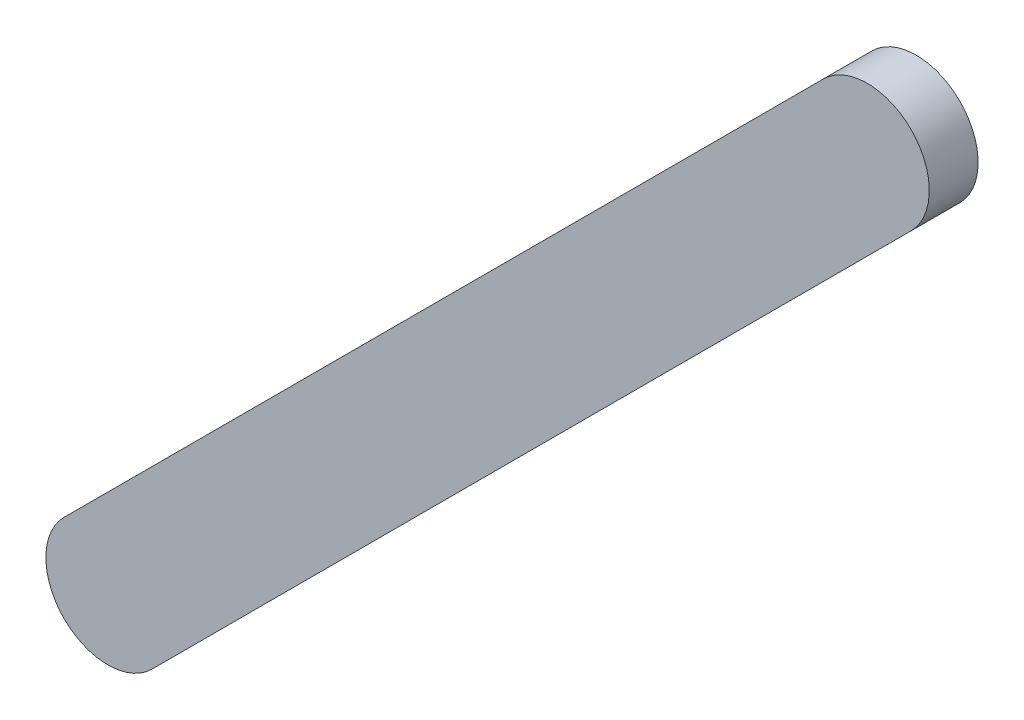
ISO-10303-21;
HEADER;
FILE_DESCRIPTION(('STEP AP214'),'2;1');
FILE_NAME('part.step','',(''),(''),'','','');
FILE_SCHEMA(('AUTOMOTIVE_DESIGN { 1 0 10303 214 1 1 1 1 }'));
ENDSEC;
DATA;
#1=APPLICATION_CONTEXT('core data for automotive mechanical design processes');
#2=APPLICATION_PROTOCOL_DEFINITION('international standard','automotive_design',2000,#1);
#3=PRODUCT_CONTEXT('',#1,'mechanical');
#4=PRODUCT('Part','Part','',(#3));
#5=PRODUCT_RELATED_PRODUCT_CATEGORY('part','',(#4));
#6=PRODUCT_DEFINITION_FORMATION('','',#4);
#7=PRODUCT_DEFINITION_CONTEXT('part definition',#1,'design');
#8=PRODUCT_DEFINITION('design','',#6,#7);
#9=PRODUCT_DEFINITION_SHAPE('','',#8);
#10=(LENGTH_UNIT() NAMED_UNIT(*) SI_UNIT(.MILLI.,.METRE.));
#11=(NAMED_UNIT(*) PLANE_ANGLE_UNIT() SI_UNIT($,.RADIAN.));
#12=(NAMED_UNIT(*) SI_UNIT($,.STERADIAN.) SOLID_ANGLE_UNIT());
#13=UNCERTAINTY_MEASURE_WITH_UNIT(LENGTH_MEASURE(1.E-05),#10,'distance_accuracy_value','');
#14=(GEOMETRIC_REPRESENTATION_CONTEXT(3) GLOBAL_UNCERTAINTY_ASSIGNED_CONTEXT((#13)) GLOBAL_UNIT_ASSIGNED_CONTEXT((#10,
#11,#12)) REPRESENTATION_CONTEXT('',''));
#15=CARTESIAN_POINT('',(0.,0.,0.));
#16=DIRECTION('',(0.,0.,1.));
#17=DIRECTION('',(1.,0.,0.));
#18=AXIS2_PLACEMENT_3D('',#15,#16,#17);
#19=CARTESIAN_POINT('',(100.1286034,75.38539406,0.));
#20=DIRECTION('',(-0.707106781186549,0.707106781186546,0.));
#21=DIRECTION('',(0.707106781186546,0.707106781186549,0.));
#22=AXIS2_PLACEMENT_3D('',#19,#20,#21);
#23=PLANE('',#22);
#24=DIRECTION('',(0.707106781186546,0.707106781186549,0.));
#25=VECTOR('',#24,1.);
#26=CARTESIAN_POINT('',(100.1286034,75.38539406,0.1999996));
#27=LINE('',#26,#25);
#28=CARTESIAN_POINT('',(100.1286034,75.38539406,0.1999996));
#29=VERTEX_POINT('',#28);
#30=CARTESIAN_POINT('',(103.23858194,78.4953726,0.1999996));
#31=VERTEX_POINT('',#30);
#32=EDGE_CURVE('E11',#29,#31,#27,.T.);
#33=ORIENTED_EDGE('',*,*,#32,.F.);
#34=DIRECTION('',(0.,0.,1.));
#35=VECTOR('',#34,1.);
#36=CARTESIAN_POINT('',(100.1286034,75.38539406,0.));
#37=LINE('',#36,#35);
#38=CARTESIAN_POINT('',(100.1286034,75.38539406,0.));
#39=VERTEX_POINT('',#38);
#40=EDGE_CURVE('E24',#39,#29,#37,.T.);
#41=ORIENTED_EDGE('',*,*,#40,.F.);
#42=DIRECTION('',(0.707106781186546,0.707106781186549,0.));
#43=VECTOR('',#42,1.);
#44=CARTESIAN_POINT('',(100.1286034,75.38539406,0.));
#45=LINE('',#44,#43);
#46=CARTESIAN_POINT('',(103.23858194,78.4953726,0.));
#47=VERTEX_POINT('',#46);
#48=EDGE_CURVE('E75',#39,#47,#45,.T.);
#49=ORIENTED_EDGE('',*,*,#48,.T.);
#50=DIRECTION('',(0.,0.,1.));
#51=VECTOR('',#50,1.);
#52=CARTESIAN_POINT('',(103.23858194,78.4953726,0.));
#53=LINE('',#52,#51);
#54=EDGE_CURVE('E37',#47,#31,#53,.T.);
#55=ORIENTED_EDGE('',*,*,#54,.T.);
#56=EDGE_LOOP('',(#33,#41,#49,#55));
#57=FACE_BOUND('',#56,.T.);
#58=ADVANCED_FACE('F17',(#57),#23,.F.);
#59=CARTESIAN_POINT('',(103.05897727,78.67497727,0.));
#60=DIRECTION('',(0.,0.,-1.));
#61=DIRECTION('',(0.707106781186548,-0.707106781186548,0.));
#62=AXIS2_PLACEMENT_3D('',#59,#60,#61);
#63=CYLINDRICAL_SURFACE('',#62,0.253999360179539);
#64=CARTESIAN_POINT('',(103.05897727,78.67497727,0.1999996));
#65=DIRECTION('',(0.,0.,1.));
#66=DIRECTION('',(0.707106781186548,-0.707106781186548,0.));
#67=AXIS2_PLACEMENT_3D('',#64,#65,#66);
#68=CIRCLE('',#67,0.253999360179539);
#69=CARTESIAN_POINT('',(102.8793726,78.85458194,0.1999996));
#70=VERTEX_POINT('',#69);
#71=EDGE_CURVE('E83',#31,#70,#68,.T.);
#72=ORIENTED_EDGE('',*,*,#71,.F.);
#73=ORIENTED_EDGE('',*,*,#54,.F.);
#74=CARTESIAN_POINT('',(103.05897727,78.67497727,0.));
#75=DIRECTION('',(0.,0.,1.));
#76=DIRECTION('',(0.707106781186548,-0.707106781186548,0.));
#77=AXIS2_PLACEMENT_3D('',#74,#75,#76);
#78=CIRCLE('',#77,0.253999360179539);
#79=CARTESIAN_POINT('',(102.8793726,78.85458194,0.));
#80=VERTEX_POINT('',#79);
#81=EDGE_CURVE('E81',#47,#80,#78,.T.);
#82=ORIENTED_EDGE('',*,*,#81,.T.);
#83=DIRECTION('',(0.,0.,1.));
#84=VECTOR('',#83,1.);
#85=CARTESIAN_POINT('',(102.8793726,78.85458194,0.));
#86=LINE('',#85,#84);
#87=EDGE_CURVE('E67',#80,#70,#86,.T.);
#88=ORIENTED_EDGE('',*,*,#87,.T.);
#89=EDGE_LOOP('',(#72,#73,#82,#88));
#90=FACE_BOUND('',#89,.T.);
#91=ADVANCED_FACE('F89',(#90),#63,.T.);
#92=CARTESIAN_POINT('',(102.8793726,78.85458194,0.));
#93=DIRECTION('',(0.707106781186546,-0.707106781186549,0.));
#94=DIRECTION('',(-0.707106781186549,-0.707106781186546,0.));
#95=AXIS2_PLACEMENT_3D('',#92,#93,#94);
#96=PLANE('',#95);
#97=DIRECTION('',(-0.707106781186549,-0.707106781186546,0.));
#98=VECTOR('',#97,1.);
#99=CARTESIAN_POINT('',(102.8793726,78.85458194,0.1999996));
#100=LINE('',#99,#98);
#101=CARTESIAN_POINT('',(99.76939406,75.7446034,0.1999996));
#102=VERTEX_POINT('',#101);
#103=EDGE_CURVE('E71',#70,#102,#100,.T.);
#104=ORIENTED_EDGE('',*,*,#103,.F.);
#105=ORIENTED_EDGE('',*,*,#87,.F.);
#106=DIRECTION('',(-0.707106781186549,-0.707106781186546,0.));
#107=VECTOR('',#106,1.);
#108=CARTESIAN_POINT('',(102.8793726,78.85458194,0.));
#109=LINE('',#108,#107);
#110=CARTESIAN_POINT('',(99.76939406,75.7446034,0.));
#111=VERTEX_POINT('',#110);
#112=EDGE_CURVE('E63',#80,#111,#109,.T.);
#113=ORIENTED_EDGE('',*,*,#112,.T.);
#114=DIRECTION('',(0.,0.,1.));
#115=VECTOR('',#114,1.);
#116=CARTESIAN_POINT('',(99.76939406,75.7446034,0.));
#117=LINE('',#116,#115);
#118=EDGE_CURVE('E53',#111,#102,#117,.T.);
#119=ORIENTED_EDGE('',*,*,#118,.T.);
#120=EDGE_LOOP('',(#104,#105,#113,#119));
#121=FACE_BOUND('',#120,.T.);
#122=ADVANCED_FACE('F66',(#121),#96,.F.);
#123=CARTESIAN_POINT('',(99.94899873,75.56499873,0.));
#124=DIRECTION('',(0.,0.,-1.));
#125=DIRECTION('',(-0.707106781186548,0.707106781186548,0.));
#126=AXIS2_PLACEMENT_3D('',#123,#124,#125);
#127=CYLINDRICAL_SURFACE('',#126,0.253999360179549);
#128=CARTESIAN_POINT('',(99.94899873,75.56499873,0.1999996));
#129=DIRECTION('',(0.,0.,1.));
#130=DIRECTION('',(-0.707106781186548,0.707106781186548,0.));
#131=AXIS2_PLACEMENT_3D('',#128,#129,#130);
#132=CIRCLE('',#131,0.253999360179549);
#133=EDGE_CURVE('E59',#102,#29,#132,.T.);
#134=ORIENTED_EDGE('',*,*,#133,.F.);
#135=ORIENTED_EDGE('',*,*,#118,.F.);
#136=CARTESIAN_POINT('',(99.94899873,75.56499873,0.));
#137=DIRECTION('',(0.,0.,1.));
#138=DIRECTION('',(-0.707106781186548,0.707106781186548,0.));
#139=AXIS2_PLACEMENT_3D('',#136,#137,#138);
#140=CIRCLE('',#139,0.253999360179549);
#141=EDGE_CURVE('E57',#111,#39,#140,.T.);
#142=ORIENTED_EDGE('',*,*,#141,.T.);
#143=ORIENTED_EDGE('',*,*,#40,.T.);
#144=EDGE_LOOP('',(#134,#135,#142,#143));
#145=FACE_BOUND('',#144,.T.);
#146=ADVANCED_FACE('F55',(#145),#127,.T.);
#147=CARTESIAN_POINT('',(100.1286034,75.38539406,0.));
#148=DIRECTION('',(0.,0.,-1.));
#149=DIRECTION('',(-1.,0.,0.));
#150=AXIS2_PLACEMENT_3D('',#147,#148,#149);
#151=PLANE('',#150);
#152=ORIENTED_EDGE('',*,*,#141,.F.);
#153=ORIENTED_EDGE('',*,*,#112,.F.);
#154=ORIENTED_EDGE('',*,*,#81,.F.);
#155=ORIENTED_EDGE('',*,*,#48,.F.);
#156=EDGE_LOOP('',(#152,#153,#154,#155));
#157=FACE_BOUND('',#156,.T.);
#158=ADVANCED_FACE('F74',(#157),#151,.T.);
#159=CARTESIAN_POINT('',(100.1286034,75.38539406,0.1999996));
#160=DIRECTION('',(0.,0.,-1.));
#161=DIRECTION('',(-1.,0.,0.));
#162=AXIS2_PLACEMENT_3D('',#159,#160,#161);
#163=PLANE('',#162);
#164=ORIENTED_EDGE('',*,*,#32,.T.);
#165=ORIENTED_EDGE('',*,*,#71,.T.);
#166=ORIENTED_EDGE('',*,*,#103,.T.);
#167=ORIENTED_EDGE('',*,*,#133,.T.);
#168=EDGE_LOOP('',(#164,#165,#166,#167));
#169=FACE_BOUND('',#168,.T.);
#170=ADVANCED_FACE('F91',(#169),#163,.F.);
#171=CLOSED_SHELL('',(#58,#91,#122,#146,#158,#170));
#172=MANIFOLD_SOLID_BREP('B1',#171);
#173=ADVANCED_BREP_SHAPE_REPRESENTATION('',(#18,#172),#14);
#174=SHAPE_DEFINITION_REPRESENTATION(#9,#173);
ENDSEC;
END-ISO-10303-21;
